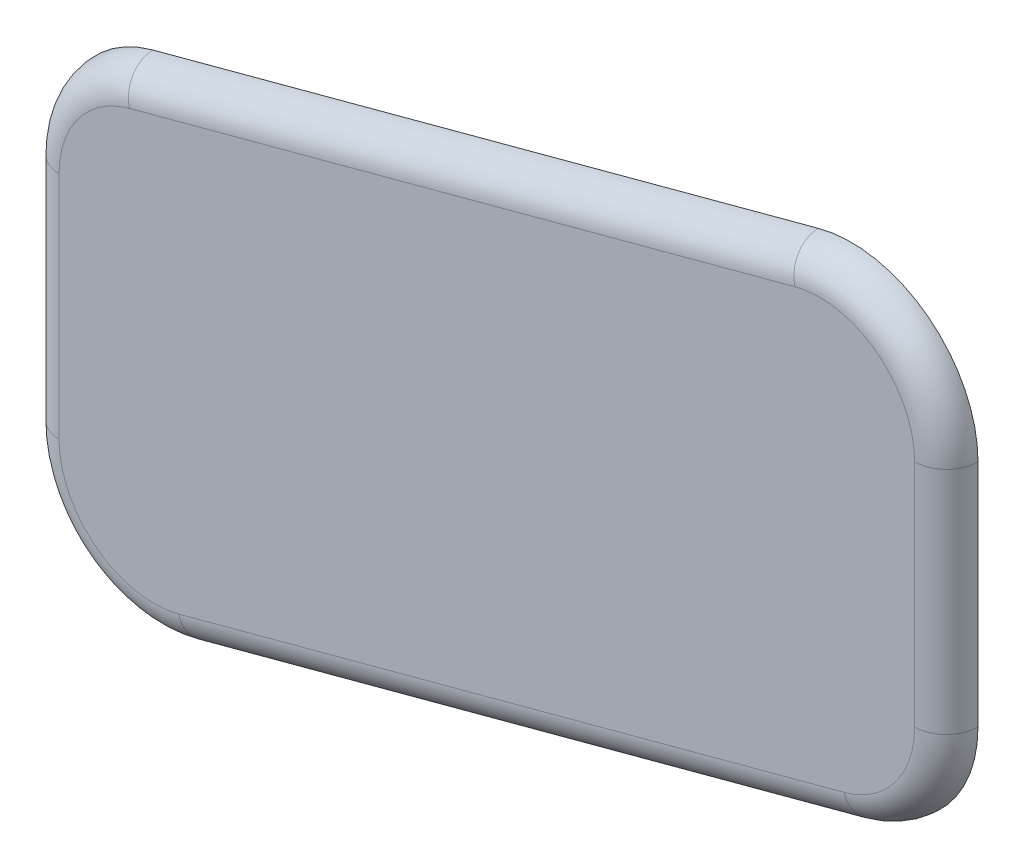
ISO-10303-21;
HEADER;
FILE_DESCRIPTION(('STEP AP214'),'2;1');
FILE_NAME('part.step','',(''),(''),'','','');
FILE_SCHEMA(('AUTOMOTIVE_DESIGN { 1 0 10303 214 1 1 1 1 }'));
ENDSEC;
DATA;
#1=APPLICATION_CONTEXT('core data for automotive mechanical design processes');
#2=APPLICATION_PROTOCOL_DEFINITION('international standard','automotive_design',2000,#1);
#3=PRODUCT_CONTEXT('',#1,'mechanical');
#4=PRODUCT('Part','Part','',(#3));
#5=PRODUCT_RELATED_PRODUCT_CATEGORY('part','',(#4));
#6=PRODUCT_DEFINITION_FORMATION('','',#4);
#7=PRODUCT_DEFINITION_CONTEXT('part definition',#1,'design');
#8=PRODUCT_DEFINITION('design','',#6,#7);
#9=PRODUCT_DEFINITION_SHAPE('','',#8);
#10=(LENGTH_UNIT() NAMED_UNIT(*) SI_UNIT(.MILLI.,.METRE.));
#11=(NAMED_UNIT(*) PLANE_ANGLE_UNIT() SI_UNIT($,.RADIAN.));
#12=(NAMED_UNIT(*) SI_UNIT($,.STERADIAN.) SOLID_ANGLE_UNIT());
#13=UNCERTAINTY_MEASURE_WITH_UNIT(LENGTH_MEASURE(1.E-05),#10,'distance_accuracy_value','');
#14=(GEOMETRIC_REPRESENTATION_CONTEXT(3) GLOBAL_UNCERTAINTY_ASSIGNED_CONTEXT((#13)) GLOBAL_UNIT_ASSIGNED_CONTEXT((#10,
#11,#12)) REPRESENTATION_CONTEXT('',''));
#15=CARTESIAN_POINT('',(0.,0.,0.));
#16=DIRECTION('',(0.,0.,1.));
#17=DIRECTION('',(1.,0.,0.));
#18=AXIS2_PLACEMENT_3D('',#15,#16,#17);
#19=CARTESIAN_POINT('',(0.,0.,1.));
#20=DIRECTION('',(0.,0.,-1.));
#21=DIRECTION('',(-1.,0.,0.));
#22=AXIS2_PLACEMENT_3D('',#19,#20,#21);
#23=PLANE('',#22);
#24=DIRECTION('',(0.,1.,0.));
#25=VECTOR('',#24,1.);
#26=CARTESIAN_POINT('',(28.,0.,1.));
#27=LINE('',#26,#25);
#28=CARTESIAN_POINT('',(28.,10.8398345324183,1.));
#29=VERTEX_POINT('',#28);
#30=CARTESIAN_POINT('',(28.,18.0867677952889,1.));
#31=VERTEX_POINT('',#30);
#32=EDGE_CURVE('E46',#29,#31,#27,.T.);
#33=ORIENTED_EDGE('',*,*,#32,.T.);
#34=CARTESIAN_POINT('',(25.,18.0867677952889,1.));
#35=DIRECTION('',(0.,0.,-1.));
#36=DIRECTION('',(-1.,0.,0.));
#37=AXIS2_PLACEMENT_3D('',#34,#35,#36);
#38=CIRCLE('',#37,3.);
#39=CARTESIAN_POINT('',(24.2235428646924,20.9845452741561,1.));
#40=VERTEX_POINT('',#39);
#41=EDGE_CURVE('E11',#31,#40,#38,.F.);
#42=ORIENTED_EDGE('',*,*,#41,.T.);
#43=DIRECTION('',(-0.965925826289069,-0.258819045102518,0.));
#44=VECTOR('',#43,1.);
#45=CARTESIAN_POINT('',(-3.62346663143525,13.522961568047,1.));
#46=LINE('',#45,#44);
#47=CARTESIAN_POINT('',(3.22354286469245,15.3576122331026,1.));
#48=VERTEX_POINT('',#47);
#49=EDGE_CURVE('E128',#40,#48,#46,.T.);
#50=ORIENTED_EDGE('',*,*,#49,.T.);
#51=CARTESIAN_POINT('',(4.,12.4598347542354,1.));
#52=DIRECTION('',(0.,0.,-1.));
#53=DIRECTION('',(-1.,0.,0.));
#54=AXIS2_PLACEMENT_3D('',#51,#52,#53);
#55=CIRCLE('',#54,3.);
#56=CARTESIAN_POINT('',(1.,12.4598347542354,1.));
#57=VERTEX_POINT('',#56);
#58=EDGE_CURVE('E130',#48,#57,#55,.F.);
#59=ORIENTED_EDGE('',*,*,#58,.T.);
#60=DIRECTION('',(0.,-1.,0.));
#61=VECTOR('',#60,1.);
#62=CARTESIAN_POINT('',(1.,0.,1.));
#63=LINE('',#62,#61);
#64=CARTESIAN_POINT('',(1.,5.21290149136481,1.));
#65=VERTEX_POINT('',#64);
#66=EDGE_CURVE('E118',#57,#65,#63,.T.);
#67=ORIENTED_EDGE('',*,*,#66,.T.);
#68=CARTESIAN_POINT('',(4.,5.21290149136481,1.));
#69=DIRECTION('',(0.,0.,-1.));
#70=DIRECTION('',(-1.,0.,0.));
#71=AXIS2_PLACEMENT_3D('',#68,#69,#70);
#72=CIRCLE('',#71,3.);
#73=CARTESIAN_POINT('',(4.77645713530756,2.3151240124976,1.));
#74=VERTEX_POINT('',#73);
#75=EDGE_CURVE('E138',#65,#74,#72,.F.);
#76=ORIENTED_EDGE('',*,*,#75,.T.);
#77=DIRECTION('',(0.965925826289069,0.258819045102518,0.));
#78=VECTOR('',#77,1.);
#79=CARTESIAN_POINT('',(-0.258819045102518,0.96592582628907,1.));
#80=LINE('',#79,#78);
#81=CARTESIAN_POINT('',(25.7764571353076,7.94205705355111,1.));
#82=VERTEX_POINT('',#81);
#83=EDGE_CURVE('E140',#74,#82,#80,.T.);
#84=ORIENTED_EDGE('',*,*,#83,.T.);
#85=CARTESIAN_POINT('',(25.,10.8398345324183,1.));
#86=DIRECTION('',(0.,0.,-1.));
#87=DIRECTION('',(-1.,0.,0.));
#88=AXIS2_PLACEMENT_3D('',#85,#86,#87);
#89=CIRCLE('',#88,3.);
#90=EDGE_CURVE('E57',#82,#29,#89,.F.);
#91=ORIENTED_EDGE('',*,*,#90,.T.);
#92=EDGE_LOOP('',(#33,#42,#50,#59,#67,#76,#84,#91));
#93=FACE_BOUND('',#92,.T.);
#94=ADVANCED_FACE('F37',(#93),#23,.F.);
#95=CARTESIAN_POINT('',(0.,0.,0.));
#96=DIRECTION('',(0.,0.,-1.));
#97=DIRECTION('',(-1.,0.,0.));
#98=AXIS2_PLACEMENT_3D('',#95,#96,#97);
#99=PLANE('',#98);
#100=DIRECTION('',(0.,-1.,0.));
#101=VECTOR('',#100,1.);
#102=CARTESIAN_POINT('',(0.,0.,0.));
#103=LINE('',#102,#101);
#104=CARTESIAN_POINT('',(0.,12.4598347542354,0.));
#105=VERTEX_POINT('',#104);
#106=CARTESIAN_POINT('',(0.,5.21290149136481,0.));
#107=VERTEX_POINT('',#106);
#108=EDGE_CURVE('E101',#105,#107,#103,.T.);
#109=ORIENTED_EDGE('',*,*,#108,.F.);
#110=CARTESIAN_POINT('',(4.,12.4598347542354,0.));
#111=DIRECTION('',(0.,0.,-1.));
#112=DIRECTION('',(-1.,0.,0.));
#113=AXIS2_PLACEMENT_3D('',#110,#111,#112);
#114=CIRCLE('',#113,4.);
#115=CARTESIAN_POINT('',(2.96472381958993,16.3235380593917,0.));
#116=VERTEX_POINT('',#115);
#117=EDGE_CURVE('E105',#105,#116,#114,.T.);
#118=ORIENTED_EDGE('',*,*,#117,.T.);
#119=DIRECTION('',(-0.965925826289069,-0.258819045102518,0.));
#120=VECTOR('',#119,1.);
#121=CARTESIAN_POINT('',(0.,15.5291427061512,0.));
#122=LINE('',#121,#120);
#123=CARTESIAN_POINT('',(23.9647238195899,21.9504711004452,0.));
#124=VERTEX_POINT('',#123);
#125=EDGE_CURVE('E166',#124,#116,#122,.T.);
#126=ORIENTED_EDGE('',*,*,#125,.F.);
#127=CARTESIAN_POINT('',(25.,18.0867677952889,0.));
#128=DIRECTION('',(0.,0.,-1.));
#129=DIRECTION('',(-1.,0.,0.));
#130=AXIS2_PLACEMENT_3D('',#127,#128,#129);
#131=CIRCLE('',#130,4.);
#132=CARTESIAN_POINT('',(29.,18.0867677952889,0.));
#133=VERTEX_POINT('',#132);
#134=EDGE_CURVE('E169',#124,#133,#131,.T.);
#135=ORIENTED_EDGE('',*,*,#134,.T.);
#136=DIRECTION('',(0.,1.,0.));
#137=VECTOR('',#136,1.);
#138=CARTESIAN_POINT('',(29.,7.77052658050247,0.));
#139=LINE('',#138,#137);
#140=CARTESIAN_POINT('',(29.,10.8398345324183,0.));
#141=VERTEX_POINT('',#140);
#142=EDGE_CURVE('E170',#141,#133,#139,.T.);
#143=ORIENTED_EDGE('',*,*,#142,.F.);
#144=CARTESIAN_POINT('',(25.,10.8398345324183,0.));
#145=DIRECTION('',(0.,0.,-1.));
#146=DIRECTION('',(-1.,0.,0.));
#147=AXIS2_PLACEMENT_3D('',#144,#145,#146);
#148=CIRCLE('',#147,4.);
#149=CARTESIAN_POINT('',(26.0352761804101,6.97613122726204,0.));
#150=VERTEX_POINT('',#149);
#151=EDGE_CURVE('E132',#141,#150,#148,.T.);
#152=ORIENTED_EDGE('',*,*,#151,.T.);
#153=DIRECTION('',(0.965925826289069,0.258819045102518,0.));
#154=VECTOR('',#153,1.);
#155=CARTESIAN_POINT('',(0.,0.,0.));
#156=LINE('',#155,#154);
#157=CARTESIAN_POINT('',(5.03527618041007,1.34919818620853,0.));
#158=VERTEX_POINT('',#157);
#159=EDGE_CURVE('E112',#158,#150,#156,.T.);
#160=ORIENTED_EDGE('',*,*,#159,.F.);
#161=CARTESIAN_POINT('',(4.,5.21290149136481,0.));
#162=DIRECTION('',(0.,0.,-1.));
#163=DIRECTION('',(-1.,0.,0.));
#164=AXIS2_PLACEMENT_3D('',#161,#162,#163);
#165=CIRCLE('',#164,4.);
#166=EDGE_CURVE('E108',#158,#107,#165,.T.);
#167=ORIENTED_EDGE('',*,*,#166,.T.);
#168=EDGE_LOOP('',(#109,#118,#126,#135,#143,#152,#160,#167));
#169=FACE_BOUND('',#168,.T.);
#170=ADVANCED_FACE('F103',(#169),#99,.T.);
#171=CARTESIAN_POINT('',(4.,5.21290149136481,0.));
#172=DIRECTION('',(0.,0.,-1.));
#173=DIRECTION('',(-1.,0.,0.));
#174=AXIS2_PLACEMENT_3D('',#171,#172,#173);
#175=TOROIDAL_SURFACE('',#174,3.,1.);
#176=CARTESIAN_POINT('',(1.,5.21290149136481,0.));
#177=DIRECTION('',(0.,1.,0.));
#178=DIRECTION('',(0.,0.,1.));
#179=AXIS2_PLACEMENT_3D('',#176,#177,#178);
#180=CIRCLE('',#179,1.);
#181=EDGE_CURVE('E152',#107,#65,#180,.T.);
#182=ORIENTED_EDGE('',*,*,#181,.F.);
#183=ORIENTED_EDGE('',*,*,#166,.F.);
#184=CARTESIAN_POINT('',(4.77645713530756,2.3151240124976,0.));
#185=DIRECTION('',(0.965925826289069,0.258819045102518,0.));
#186=DIRECTION('',(-0.258819045102518,0.965925826289069,0.));
#187=AXIS2_PLACEMENT_3D('',#184,#185,#186);
#188=CIRCLE('',#187,1.);
#189=EDGE_CURVE('E41',#74,#158,#188,.T.);
#190=ORIENTED_EDGE('',*,*,#189,.F.);
#191=ORIENTED_EDGE('',*,*,#75,.F.);
#192=EDGE_LOOP('',(#182,#183,#190,#191));
#193=FACE_BOUND('',#192,.T.);
#194=ADVANCED_FACE('F39',(#193),#175,.T.);
#195=CARTESIAN_POINT('',(-0.258819045102518,0.965925826289069,0.));
#196=DIRECTION('',(0.965925826289069,0.258819045102518,0.));
#197=DIRECTION('',(-0.258819045102518,0.965925826289069,0.));
#198=AXIS2_PLACEMENT_3D('',#195,#196,#197);
#199=CYLINDRICAL_SURFACE('',#198,1.);
#200=ORIENTED_EDGE('',*,*,#189,.T.);
#201=ORIENTED_EDGE('',*,*,#159,.T.);
#202=CARTESIAN_POINT('',(25.7764571353076,7.94205705355111,0.));
#203=DIRECTION('',(0.965925826289069,0.258819045102519,0.));
#204=DIRECTION('',(-0.258819045102519,0.965925826289069,0.));
#205=AXIS2_PLACEMENT_3D('',#202,#203,#204);
#206=CIRCLE('',#205,1.);
#207=EDGE_CURVE('E121',#82,#150,#206,.T.);
#208=ORIENTED_EDGE('',*,*,#207,.F.);
#209=ORIENTED_EDGE('',*,*,#83,.F.);
#210=EDGE_LOOP('',(#200,#201,#208,#209));
#211=FACE_BOUND('',#210,.T.);
#212=ADVANCED_FACE('F158',(#211),#199,.T.);
#213=CARTESIAN_POINT('',(1.,0.,0.));
#214=DIRECTION('',(0.,-1.,0.));
#215=DIRECTION('',(1.,0.,0.));
#216=AXIS2_PLACEMENT_3D('',#213,#214,#215);
#217=CYLINDRICAL_SURFACE('',#216,1.);
#218=ORIENTED_EDGE('',*,*,#181,.T.);
#219=ORIENTED_EDGE('',*,*,#66,.F.);
#220=CARTESIAN_POINT('',(1.,12.4598347542354,0.));
#221=DIRECTION('',(0.,1.,0.));
#222=DIRECTION('',(0.,0.,1.));
#223=AXIS2_PLACEMENT_3D('',#220,#221,#222);
#224=CIRCLE('',#223,1.);
#225=EDGE_CURVE('E116',#105,#57,#224,.T.);
#226=ORIENTED_EDGE('',*,*,#225,.F.);
#227=ORIENTED_EDGE('',*,*,#108,.T.);
#228=EDGE_LOOP('',(#218,#219,#226,#227));
#229=FACE_BOUND('',#228,.T.);
#230=ADVANCED_FACE('F117',(#229),#217,.T.);
#231=CARTESIAN_POINT('',(25.,10.8398345324183,0.));
#232=DIRECTION('',(0.,0.,-1.));
#233=DIRECTION('',(-1.,0.,0.));
#234=AXIS2_PLACEMENT_3D('',#231,#232,#233);
#235=TOROIDAL_SURFACE('',#234,3.,1.);
#236=ORIENTED_EDGE('',*,*,#207,.T.);
#237=ORIENTED_EDGE('',*,*,#151,.F.);
#238=CARTESIAN_POINT('',(28.,10.8398345324183,0.));
#239=DIRECTION('',(0.,1.,0.));
#240=DIRECTION('',(0.,0.,1.));
#241=AXIS2_PLACEMENT_3D('',#238,#239,#240);
#242=CIRCLE('',#241,1.);
#243=EDGE_CURVE('E122',#29,#141,#242,.T.);
#244=ORIENTED_EDGE('',*,*,#243,.F.);
#245=ORIENTED_EDGE('',*,*,#90,.F.);
#246=EDGE_LOOP('',(#236,#237,#244,#245));
#247=FACE_BOUND('',#246,.T.);
#248=ADVANCED_FACE('F178',(#247),#235,.T.);
#249=CARTESIAN_POINT('',(4.,12.4598347542354,0.));
#250=DIRECTION('',(0.,0.,-1.));
#251=DIRECTION('',(-1.,0.,0.));
#252=AXIS2_PLACEMENT_3D('',#249,#250,#251);
#253=TOROIDAL_SURFACE('',#252,3.,1.);
#254=ORIENTED_EDGE('',*,*,#225,.T.);
#255=ORIENTED_EDGE('',*,*,#58,.F.);
#256=CARTESIAN_POINT('',(3.22354286469245,15.3576122331026,0.));
#257=DIRECTION('',(0.965925826289069,0.258819045102518,0.));
#258=DIRECTION('',(-0.258819045102518,0.965925826289069,0.));
#259=AXIS2_PLACEMENT_3D('',#256,#257,#258);
#260=CIRCLE('',#259,1.);
#261=EDGE_CURVE('E126',#116,#48,#260,.T.);
#262=ORIENTED_EDGE('',*,*,#261,.F.);
#263=ORIENTED_EDGE('',*,*,#117,.F.);
#264=EDGE_LOOP('',(#254,#255,#262,#263));
#265=FACE_BOUND('',#264,.T.);
#266=ADVANCED_FACE('F124',(#265),#253,.T.);
#267=CARTESIAN_POINT('',(28.,0.,0.));
#268=DIRECTION('',(0.,1.,0.));
#269=DIRECTION('',(-1.,0.,0.));
#270=AXIS2_PLACEMENT_3D('',#267,#268,#269);
#271=CYLINDRICAL_SURFACE('',#270,1.);
#272=ORIENTED_EDGE('',*,*,#243,.T.);
#273=ORIENTED_EDGE('',*,*,#142,.T.);
#274=CARTESIAN_POINT('',(28.,18.0867677952889,0.));
#275=DIRECTION('',(0.,1.,0.));
#276=DIRECTION('',(0.,0.,1.));
#277=AXIS2_PLACEMENT_3D('',#274,#275,#276);
#278=CIRCLE('',#277,1.);
#279=EDGE_CURVE('E146',#31,#133,#278,.T.);
#280=ORIENTED_EDGE('',*,*,#279,.F.);
#281=ORIENTED_EDGE('',*,*,#32,.F.);
#282=EDGE_LOOP('',(#272,#273,#280,#281));
#283=FACE_BOUND('',#282,.T.);
#284=ADVANCED_FACE('F180',(#283),#271,.T.);
#285=CARTESIAN_POINT('',(-3.62346663143525,13.522961568047,0.));
#286=DIRECTION('',(-0.965925826289069,-0.258819045102518,0.));
#287=DIRECTION('',(0.258819045102518,-0.965925826289069,0.));
#288=AXIS2_PLACEMENT_3D('',#285,#286,#287);
#289=CYLINDRICAL_SURFACE('',#288,1.);
#290=ORIENTED_EDGE('',*,*,#261,.T.);
#291=ORIENTED_EDGE('',*,*,#49,.F.);
#292=CARTESIAN_POINT('',(24.2235428646924,20.9845452741561,0.));
#293=DIRECTION('',(0.965925826289069,0.25881904510252,0.));
#294=DIRECTION('',(-0.25881904510252,0.965925826289069,0.));
#295=AXIS2_PLACEMENT_3D('',#292,#293,#294);
#296=CIRCLE('',#295,1.);
#297=EDGE_CURVE('E144',#124,#40,#296,.T.);
#298=ORIENTED_EDGE('',*,*,#297,.F.);
#299=ORIENTED_EDGE('',*,*,#125,.T.);
#300=EDGE_LOOP('',(#290,#291,#298,#299));
#301=FACE_BOUND('',#300,.T.);
#302=ADVANCED_FACE('F164',(#301),#289,.T.);
#303=CARTESIAN_POINT('',(25.,18.0867677952889,0.));
#304=DIRECTION('',(0.,0.,-1.));
#305=DIRECTION('',(-1.,0.,0.));
#306=AXIS2_PLACEMENT_3D('',#303,#304,#305);
#307=TOROIDAL_SURFACE('',#306,3.,1.);
#308=ORIENTED_EDGE('',*,*,#279,.T.);
#309=ORIENTED_EDGE('',*,*,#134,.F.);
#310=ORIENTED_EDGE('',*,*,#297,.T.);
#311=ORIENTED_EDGE('',*,*,#41,.F.);
#312=EDGE_LOOP('',(#308,#309,#310,#311));
#313=FACE_BOUND('',#312,.T.);
#314=ADVANCED_FACE('F183',(#313),#307,.T.);
#315=CLOSED_SHELL('',(#94,#170,#194,#212,#230,#248,#266,#284,#302,#314));
#316=MANIFOLD_SOLID_BREP('B2',#315);
#317=ADVANCED_BREP_SHAPE_REPRESENTATION('',(#18,#316),#14);
#318=SHAPE_DEFINITION_REPRESENTATION(#9,#317);
ENDSEC;
END-ISO-10303-21;
